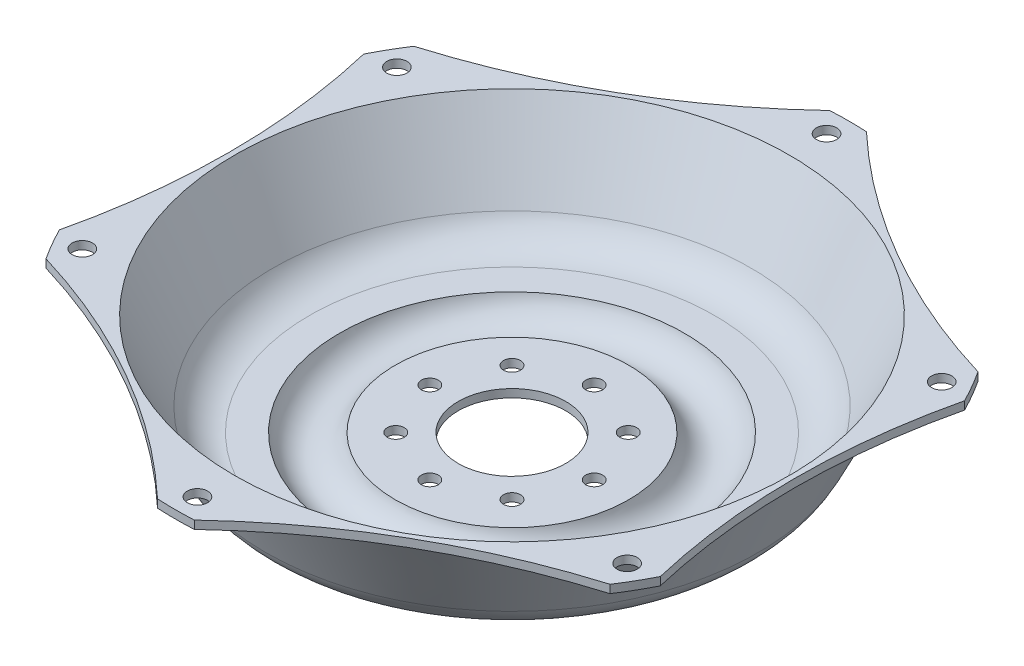
ISO-10303-21;
HEADER;
FILE_DESCRIPTION(('STEP AP214'),'2;1');
FILE_NAME('part.step','',(''),(''),'','','');
FILE_SCHEMA(('AUTOMOTIVE_DESIGN { 1 0 10303 214 1 1 1 1 }'));
ENDSEC;
DATA;
#1=APPLICATION_CONTEXT('core data for automotive mechanical design processes');
#2=APPLICATION_PROTOCOL_DEFINITION('international standard','automotive_design',2000,#1);
#3=PRODUCT_CONTEXT('',#1,'mechanical');
#4=PRODUCT('Part','Part','',(#3));
#5=PRODUCT_RELATED_PRODUCT_CATEGORY('part','',(#4));
#6=PRODUCT_DEFINITION_FORMATION('','',#4);
#7=PRODUCT_DEFINITION_CONTEXT('part definition',#1,'design');
#8=PRODUCT_DEFINITION('design','',#6,#7);
#9=PRODUCT_DEFINITION_SHAPE('','',#8);
#10=(LENGTH_UNIT() NAMED_UNIT(*) SI_UNIT(.MILLI.,.METRE.));
#11=(NAMED_UNIT(*) PLANE_ANGLE_UNIT() SI_UNIT($,.RADIAN.));
#12=(NAMED_UNIT(*) SI_UNIT($,.STERADIAN.) SOLID_ANGLE_UNIT());
#13=UNCERTAINTY_MEASURE_WITH_UNIT(LENGTH_MEASURE(1.E-05),#10,'distance_accuracy_value','');
#14=(GEOMETRIC_REPRESENTATION_CONTEXT(3) GLOBAL_UNCERTAINTY_ASSIGNED_CONTEXT((#13)) GLOBAL_UNIT_ASSIGNED_CONTEXT((#10,
#11,#12)) REPRESENTATION_CONTEXT('',''));
#15=CARTESIAN_POINT('',(0.,0.,0.));
#16=DIRECTION('',(0.,0.,1.));
#17=DIRECTION('',(1.,0.,0.));
#18=AXIS2_PLACEMENT_3D('',#15,#16,#17);
#19=CARTESIAN_POINT('',(0.,150.,0.));
#20=DIRECTION('',(0.,1.,0.));
#21=DIRECTION('',(0.,0.,1.));
#22=AXIS2_PLACEMENT_3D('',#19,#20,#21);
#23=CYLINDRICAL_SURFACE('',#22,497.75);
#24=CARTESIAN_POINT('',(0.,150.,0.));
#25=DIRECTION('',(0.,1.,0.));
#26=DIRECTION('',(0.,0.,1.));
#27=AXIS2_PLACEMENT_3D('',#24,#25,#26);
#28=CIRCLE('',#27,497.75);
#29=CARTESIAN_POINT('',(443.929491177126,150.,-225.12589669609));
#30=VERTEX_POINT('',#29);
#31=CARTESIAN_POINT('',(416.775220580377,150.,-272.127686959961));
#32=VERTEX_POINT('',#31);
#33=EDGE_CURVE('E160',#30,#32,#28,.T.);
#34=ORIENTED_EDGE('',*,*,#33,.F.);
#35=DIRECTION('',(0.,-1.,0.));
#36=VECTOR('',#35,1.);
#37=CARTESIAN_POINT('',(443.929491177126,150.,-225.12589669609));
#38=LINE('',#37,#36);
#39=CARTESIAN_POINT('',(443.929491177126,138.,-225.12589669609));
#40=VERTEX_POINT('',#39);
#41=EDGE_CURVE('E145',#30,#40,#38,.T.);
#42=ORIENTED_EDGE('',*,*,#41,.T.);
#43=CARTESIAN_POINT('',(0.,138.,0.));
#44=DIRECTION('',(0.,1.,0.));
#45=DIRECTION('',(0.,0.,1.));
#46=AXIS2_PLACEMENT_3D('',#43,#44,#45);
#47=CIRCLE('',#46,497.75);
#48=CARTESIAN_POINT('',(416.775220580377,138.,-272.127686959961));
#49=VERTEX_POINT('',#48);
#50=EDGE_CURVE('E158',#40,#49,#47,.T.);
#51=ORIENTED_EDGE('',*,*,#50,.T.);
#52=DIRECTION('',(0.,-1.,0.));
#53=VECTOR('',#52,1.);
#54=CARTESIAN_POINT('',(416.775220580377,150.,-272.127686959961));
#55=LINE('',#54,#53);
#56=EDGE_CURVE('E295',#32,#49,#55,.T.);
#57=ORIENTED_EDGE('',*,*,#56,.F.);
#58=EDGE_LOOP('',(#34,#42,#51,#57));
#59=FACE_BOUND('',#58,.T.);
#60=ADVANCED_FACE('F37',(#59),#23,.T.);
#61=CARTESIAN_POINT('',(416.929491177127,138.,271.891268500447));
#62=VERTEX_POINT('',#61);
#63=CARTESIAN_POINT('',(444.057100270615,138.,224.874085210487));
#64=VERTEX_POINT('',#63);
#65=EDGE_CURVE('E167',#62,#64,#47,.T.);
#66=ORIENTED_EDGE('',*,*,#65,.T.);
#67=DIRECTION('',(0.,-1.,0.));
#68=VECTOR('',#67,1.);
#69=CARTESIAN_POINT('',(444.057100270615,150.,224.874085210487));
#70=LINE('',#69,#68);
#71=CARTESIAN_POINT('',(444.057100270615,150.,224.874085210487));
#72=VERTEX_POINT('',#71);
#73=EDGE_CURVE('E305',#72,#64,#70,.T.);
#74=ORIENTED_EDGE('',*,*,#73,.F.);
#75=CARTESIAN_POINT('',(416.929491177127,150.,271.891268500447));
#76=VERTEX_POINT('',#75);
#77=EDGE_CURVE('E217',#76,#72,#28,.T.);
#78=ORIENTED_EDGE('',*,*,#77,.F.);
#79=DIRECTION('',(0.,-1.,0.));
#80=VECTOR('',#79,1.);
#81=CARTESIAN_POINT('',(416.929491177127,150.,271.891268500447));
#82=LINE('',#81,#80);
#83=EDGE_CURVE('E270',#76,#62,#82,.T.);
#84=ORIENTED_EDGE('',*,*,#83,.T.);
#85=EDGE_LOOP('',(#66,#74,#78,#84));
#86=FACE_BOUND('',#85,.T.);
#87=ADVANCED_FACE('F408',(#86),#23,.T.);
#88=CARTESIAN_POINT('',(27.,150.,-497.017165196535));
#89=VERTEX_POINT('',#88);
#90=CARTESIAN_POINT('',(-27.2818796902415,150.,-497.001772170449));
#91=VERTEX_POINT('',#90);
#92=EDGE_CURVE('E447',#89,#91,#28,.T.);
#93=ORIENTED_EDGE('',*,*,#92,.F.);
#94=DIRECTION('',(0.,-1.,0.));
#95=VECTOR('',#94,1.);
#96=CARTESIAN_POINT('',(27.,150.,-497.017165196535));
#97=LINE('',#96,#95);
#98=CARTESIAN_POINT('',(27.,138.,-497.017165196535));
#99=VERTEX_POINT('',#98);
#100=EDGE_CURVE('E299',#89,#99,#97,.T.);
#101=ORIENTED_EDGE('',*,*,#100,.T.);
#102=CARTESIAN_POINT('',(-27.2818796902415,138.,-497.001772170449));
#103=VERTEX_POINT('',#102);
#104=EDGE_CURVE('E168',#99,#103,#47,.T.);
#105=ORIENTED_EDGE('',*,*,#104,.T.);
#106=DIRECTION('',(0.,-1.,0.));
#107=VECTOR('',#106,1.);
#108=CARTESIAN_POINT('',(-27.2818796902415,150.,-497.001772170449));
#109=LINE('',#108,#107);
#110=EDGE_CURVE('E286',#91,#103,#109,.T.);
#111=ORIENTED_EDGE('',*,*,#110,.F.);
#112=EDGE_LOOP('',(#93,#101,#105,#111));
#113=FACE_BOUND('',#112,.T.);
#114=ADVANCED_FACE('F413',(#113),#23,.T.);
#115=CARTESIAN_POINT('',(-416.929491177129,150.,-271.891268500444));
#116=VERTEX_POINT('',#115);
#117=CARTESIAN_POINT('',(-444.057100270616,150.,-224.874085210484));
#118=VERTEX_POINT('',#117);
#119=EDGE_CURVE('E445',#116,#118,#28,.T.);
#120=ORIENTED_EDGE('',*,*,#119,.F.);
#121=DIRECTION('',(0.,-1.,0.));
#122=VECTOR('',#121,1.);
#123=CARTESIAN_POINT('',(-416.929491177129,150.,-271.891268500444));
#124=LINE('',#123,#122);
#125=CARTESIAN_POINT('',(-416.929491177129,138.,-271.891268500444));
#126=VERTEX_POINT('',#125);
#127=EDGE_CURVE('E290',#116,#126,#124,.T.);
#128=ORIENTED_EDGE('',*,*,#127,.T.);
#129=CARTESIAN_POINT('',(-444.057100270616,138.,-224.874085210484));
#130=VERTEX_POINT('',#129);
#131=EDGE_CURVE('E172',#126,#130,#47,.T.);
#132=ORIENTED_EDGE('',*,*,#131,.T.);
#133=DIRECTION('',(0.,-1.,0.));
#134=VECTOR('',#133,1.);
#135=CARTESIAN_POINT('',(-444.057100270616,150.,-224.874085210484));
#136=LINE('',#135,#134);
#137=EDGE_CURVE('E277',#118,#130,#136,.T.);
#138=ORIENTED_EDGE('',*,*,#137,.F.);
#139=EDGE_LOOP('',(#120,#128,#132,#138));
#140=FACE_BOUND('',#139,.T.);
#141=ADVANCED_FACE('F431',(#140),#23,.T.);
#142=CARTESIAN_POINT('',(-443.929491177124,150.,225.125896696093));
#143=VERTEX_POINT('',#142);
#144=CARTESIAN_POINT('',(-416.775220580377,150.,272.127686959961));
#145=VERTEX_POINT('',#144);
#146=EDGE_CURVE('E214',#143,#145,#28,.T.);
#147=ORIENTED_EDGE('',*,*,#146,.F.);
#148=DIRECTION('',(0.,-1.,0.));
#149=VECTOR('',#148,1.);
#150=CARTESIAN_POINT('',(-443.929491177124,150.,225.125896696093));
#151=LINE('',#150,#149);
#152=CARTESIAN_POINT('',(-443.929491177124,138.,225.125896696093));
#153=VERTEX_POINT('',#152);
#154=EDGE_CURVE('E281',#143,#153,#151,.T.);
#155=ORIENTED_EDGE('',*,*,#154,.T.);
#156=CARTESIAN_POINT('',(-416.775220580377,138.,272.127686959961));
#157=VERTEX_POINT('',#156);
#158=EDGE_CURVE('E176',#153,#157,#47,.T.);
#159=ORIENTED_EDGE('',*,*,#158,.T.);
#160=DIRECTION('',(0.,-1.,0.));
#161=VECTOR('',#160,1.);
#162=CARTESIAN_POINT('',(-416.775220580377,150.,272.127686959961));
#163=LINE('',#162,#161);
#164=EDGE_CURVE('E221',#145,#157,#163,.T.);
#165=ORIENTED_EDGE('',*,*,#164,.F.);
#166=EDGE_LOOP('',(#147,#155,#159,#165));
#167=FACE_BOUND('',#166,.T.);
#168=ADVANCED_FACE('F419',(#167),#23,.T.);
#169=CARTESIAN_POINT('',(410.214525598978,138.,0.));
#170=DIRECTION('',(0.,1.,0.));
#171=DIRECTION('',(0.,0.,1.));
#172=AXIS2_PLACEMENT_3D('',#169,#170,#171);
#173=PLANE('',#172);
#174=CARTESIAN_POINT('',(1394.02497264132,138.,-0.39531171158369));
#175=DIRECTION('',(0.,-1.,0.));
#176=DIRECTION('',(-0.866025403784436,0.,0.500000000000004));
#177=AXIS2_PLACEMENT_3D('',#174,#175,#176);
#178=CIRCLE('',#177,976.312070869839);
#179=CARTESIAN_POINT('',(417.712941026651,138.,-0.118453270858577));
#180=VERTEX_POINT('',#179);
#181=EDGE_CURVE('E148',#180,#64,#178,.F.);
#182=ORIENTED_EDGE('',*,*,#181,.T.);
#183=ORIENTED_EDGE('',*,*,#65,.F.);
#184=CARTESIAN_POINT('',(697.354836305301,138.,1207.0633839615));
#185=DIRECTION('',(0.,-1.,0.));
#186=DIRECTION('',(-0.86602540378444,0.,-0.499999999999998));
#187=AXIS2_PLACEMENT_3D('',#184,#185,#186);
#188=CIRCLE('',#187,976.312070869839);
#189=CARTESIAN_POINT('',(208.95905405505,138.,361.690791783162));
#190=VERTEX_POINT('',#189);
#191=EDGE_CURVE('E273',#62,#190,#188,.F.);
#192=ORIENTED_EDGE('',*,*,#191,.T.);
#193=CARTESIAN_POINT('',(0.,138.,0.));
#194=DIRECTION('',(0.,1.,0.));
#195=DIRECTION('',(0.,0.,1.));
#196=AXIS2_PLACEMENT_3D('',#193,#194,#195);
#197=CIRCLE('',#196,417.71295782189);
#198=EDGE_CURVE('E185',#190,#180,#197,.T.);
#199=ORIENTED_EDGE('',*,*,#198,.T.);
#200=EDGE_LOOP('',(#182,#183,#192,#199));
#201=FACE_BOUND('',#200,.T.);
#202=CARTESIAN_POINT('',(402.701812759764,138.,232.499999999999));
#203=DIRECTION('',(0.,-1.,0.));
#204=DIRECTION('',(-0.86602540378444,0.,-0.499999999999998));
#205=AXIS2_PLACEMENT_3D('',#202,#203,#204);
#206=CIRCLE('',#205,15.);
#207=CARTESIAN_POINT('',(389.711431702998,138.,224.999999999999));
#208=VERTEX_POINT('',#207);
#209=EDGE_CURVE('E234',#208,#208,#206,.T.);
#210=ORIENTED_EDGE('',*,*,#209,.F.);
#211=EDGE_LOOP('',(#210));
#212=FACE_BOUND('',#211,.T.);
#213=ADVANCED_FACE('F430',(#201,#212),#173,.F.);
#214=EDGE_CURVE('E142',#40,#180,#178,.F.);
#215=ORIENTED_EDGE('',*,*,#214,.T.);
#216=CARTESIAN_POINT('',(208.753886971602,138.,-361.809245054019));
#217=VERTEX_POINT('',#216);
#218=EDGE_CURVE('E463',#180,#217,#197,.T.);
#219=ORIENTED_EDGE('',*,*,#218,.T.);
#220=CARTESIAN_POINT('',(696.67013633602,138.,-1207.45869567308));
#221=DIRECTION('',(0.,-1.,0.));
#222=DIRECTION('',(0.,0.,1.));
#223=AXIS2_PLACEMENT_3D('',#220,#221,#222);
#224=CIRCLE('',#223,976.312070869839);
#225=EDGE_CURVE('E166',#217,#49,#224,.F.);
#226=ORIENTED_EDGE('',*,*,#225,.T.);
#227=ORIENTED_EDGE('',*,*,#50,.F.);
#228=EDGE_LOOP('',(#215,#219,#226,#227));
#229=FACE_BOUND('',#228,.T.);
#230=CARTESIAN_POINT('',(402.701812759763,138.,-232.500000000002));
#231=DIRECTION('',(0.,-1.,0.));
#232=DIRECTION('',(-0.866025403784436,0.,0.500000000000004));
#233=AXIS2_PLACEMENT_3D('',#230,#231,#232);
#234=CIRCLE('',#233,15.);
#235=CARTESIAN_POINT('',(389.711431702996,138.,-225.000000000002));
#236=VERTEX_POINT('',#235);
#237=EDGE_CURVE('E242',#236,#236,#234,.T.);
#238=ORIENTED_EDGE('',*,*,#237,.F.);
#239=EDGE_LOOP('',(#238));
#240=FACE_BOUND('',#239,.T.);
#241=ADVANCED_FACE('F164',(#229,#240),#173,.F.);
#242=EDGE_CURVE('E302',#99,#217,#224,.F.);
#243=ORIENTED_EDGE('',*,*,#242,.T.);
#244=CARTESIAN_POINT('',(-208.959054055052,138.,-361.690791783161));
#245=VERTEX_POINT('',#244);
#246=EDGE_CURVE('E464',#217,#245,#197,.T.);
#247=ORIENTED_EDGE('',*,*,#246,.T.);
#248=CARTESIAN_POINT('',(-697.35483630531,138.,-1207.06338396149));
#249=DIRECTION('',(0.,-1.,0.));
#250=DIRECTION('',(0.866025403784443,0.,0.499999999999992));
#251=AXIS2_PLACEMENT_3D('',#248,#249,#250);
#252=CIRCLE('',#251,976.312070869839);
#253=EDGE_CURVE('E59',#245,#103,#252,.F.);
#254=ORIENTED_EDGE('',*,*,#253,.T.);
#255=ORIENTED_EDGE('',*,*,#104,.F.);
#256=EDGE_LOOP('',(#243,#247,#254,#255));
#257=FACE_BOUND('',#256,.T.);
#258=CARTESIAN_POINT('',(0.,138.,-465.));
#259=DIRECTION('',(0.,-1.,0.));
#260=DIRECTION('',(0.,0.,1.));
#261=AXIS2_PLACEMENT_3D('',#258,#259,#260);
#262=CIRCLE('',#261,15.);
#263=CARTESIAN_POINT('',(0.,138.,-450.));
#264=VERTEX_POINT('',#263);
#265=EDGE_CURVE('E257',#264,#264,#262,.T.);
#266=ORIENTED_EDGE('',*,*,#265,.F.);
#267=EDGE_LOOP('',(#266));
#268=FACE_BOUND('',#267,.T.);
#269=ADVANCED_FACE('F427',(#257,#268),#173,.F.);
#270=EDGE_CURVE('E293',#126,#245,#252,.F.);
#271=ORIENTED_EDGE('',*,*,#270,.T.);
#272=CARTESIAN_POINT('',(-417.712941026651,138.,0.118453270861505));
#273=VERTEX_POINT('',#272);
#274=EDGE_CURVE('E466',#245,#273,#197,.T.);
#275=ORIENTED_EDGE('',*,*,#274,.T.);
#276=CARTESIAN_POINT('',(-1394.02497264132,138.,0.39531171159346));
#277=DIRECTION('',(0.,-1.,0.));
#278=DIRECTION('',(0.866025403784433,0.,-0.50000000000001));
#279=AXIS2_PLACEMENT_3D('',#276,#277,#278);
#280=CIRCLE('',#279,976.312070869839);
#281=EDGE_CURVE('E51',#273,#130,#280,.F.);
#282=ORIENTED_EDGE('',*,*,#281,.T.);
#283=ORIENTED_EDGE('',*,*,#131,.F.);
#284=EDGE_LOOP('',(#271,#275,#282,#283));
#285=FACE_BOUND('',#284,.T.);
#286=CARTESIAN_POINT('',(-402.701812759766,138.,-232.499999999996));
#287=DIRECTION('',(0.,-1.,0.));
#288=DIRECTION('',(0.866025403784443,0.,0.499999999999992));
#289=AXIS2_PLACEMENT_3D('',#286,#287,#288);
#290=CIRCLE('',#289,15.);
#291=CARTESIAN_POINT('',(-389.711431703,138.,-224.999999999996));
#292=VERTEX_POINT('',#291);
#293=EDGE_CURVE('E251',#292,#292,#290,.T.);
#294=ORIENTED_EDGE('',*,*,#293,.F.);
#295=EDGE_LOOP('',(#294));
#296=FACE_BOUND('',#295,.T.);
#297=ADVANCED_FACE('F417',(#285,#296),#173,.F.);
#298=CARTESIAN_POINT('',(-27.,138.,497.017165196535));
#299=VERTEX_POINT('',#298);
#300=CARTESIAN_POINT('',(27.2818796902381,138.,497.001772170449));
#301=VERTEX_POINT('',#300);
#302=EDGE_CURVE('E170',#299,#301,#47,.T.);
#303=ORIENTED_EDGE('',*,*,#302,.T.);
#304=DIRECTION('',(0.,-1.,0.));
#305=VECTOR('',#304,1.);
#306=CARTESIAN_POINT('',(27.2818796902381,150.,497.001772170449));
#307=LINE('',#306,#305);
#308=CARTESIAN_POINT('',(27.2818796902381,150.,497.001772170449));
#309=VERTEX_POINT('',#308);
#310=EDGE_CURVE('E250',#309,#301,#307,.T.);
#311=ORIENTED_EDGE('',*,*,#310,.F.);
#312=CARTESIAN_POINT('',(-27.,150.,497.017165196535));
#313=VERTEX_POINT('',#312);
#314=EDGE_CURVE('E211',#313,#309,#28,.T.);
#315=ORIENTED_EDGE('',*,*,#314,.F.);
#316=DIRECTION('',(0.,-1.,0.));
#317=VECTOR('',#316,1.);
#318=CARTESIAN_POINT('',(-27.,150.,497.017165196535));
#319=LINE('',#318,#317);
#320=EDGE_CURVE('E218',#313,#299,#319,.T.);
#321=ORIENTED_EDGE('',*,*,#320,.T.);
#322=EDGE_LOOP('',(#303,#311,#315,#321));
#323=FACE_BOUND('',#322,.T.);
#324=ADVANCED_FACE('F409',(#323),#23,.T.);
#325=EDGE_CURVE('E276',#190,#301,#188,.F.);
#326=ORIENTED_EDGE('',*,*,#325,.T.);
#327=ORIENTED_EDGE('',*,*,#302,.F.);
#328=CARTESIAN_POINT('',(-696.67013633602,138.,1207.45869567308));
#329=DIRECTION('',(0.,-1.,0.));
#330=DIRECTION('',(0.,0.,-1.));
#331=AXIS2_PLACEMENT_3D('',#328,#329,#330);
#332=CIRCLE('',#331,976.312070869839);
#333=CARTESIAN_POINT('',(-208.753886971602,138.,361.809245054019));
#334=VERTEX_POINT('',#333);
#335=EDGE_CURVE('E225',#299,#334,#332,.F.);
#336=ORIENTED_EDGE('',*,*,#335,.T.);
#337=EDGE_CURVE('E182',#334,#190,#197,.T.);
#338=ORIENTED_EDGE('',*,*,#337,.T.);
#339=EDGE_LOOP('',(#326,#327,#336,#338));
#340=FACE_BOUND('',#339,.T.);
#341=CARTESIAN_POINT('',(0.,138.,465.));
#342=DIRECTION('',(0.,-1.,0.));
#343=DIRECTION('',(0.,0.,-1.));
#344=AXIS2_PLACEMENT_3D('',#341,#342,#343);
#345=CIRCLE('',#344,15.);
#346=CARTESIAN_POINT('',(0.,138.,450.));
#347=VERTEX_POINT('',#346);
#348=EDGE_CURVE('E231',#347,#347,#345,.T.);
#349=ORIENTED_EDGE('',*,*,#348,.F.);
#350=EDGE_LOOP('',(#349));
#351=FACE_BOUND('',#350,.T.);
#352=ADVANCED_FACE('F416',(#340,#351),#173,.F.);
#353=CARTESIAN_POINT('',(410.214525598978,150.,0.));
#354=DIRECTION('',(0.,1.,0.));
#355=DIRECTION('',(0.,0.,1.));
#356=AXIS2_PLACEMENT_3D('',#353,#354,#355);
#357=PLANE('',#356);
#358=CARTESIAN_POINT('',(402.701812759763,150.,-232.500000000002));
#359=DIRECTION('',(0.,-1.,0.));
#360=DIRECTION('',(-0.866025403784436,0.,0.500000000000004));
#361=AXIS2_PLACEMENT_3D('',#358,#359,#360);
#362=CIRCLE('',#361,15.);
#363=CARTESIAN_POINT('',(389.711431702996,150.,-225.000000000002));
#364=VERTEX_POINT('',#363);
#365=EDGE_CURVE('E260',#364,#364,#362,.T.);
#366=ORIENTED_EDGE('',*,*,#365,.T.);
#367=EDGE_LOOP('',(#366));
#368=FACE_BOUND('',#367,.T.);
#369=CARTESIAN_POINT('',(0.,150.,-465.));
#370=DIRECTION('',(0.,-1.,0.));
#371=DIRECTION('',(0.,0.,1.));
#372=AXIS2_PLACEMENT_3D('',#369,#370,#371);
#373=CIRCLE('',#372,15.);
#374=CARTESIAN_POINT('',(0.,150.,-450.));
#375=VERTEX_POINT('',#374);
#376=EDGE_CURVE('E254',#375,#375,#373,.T.);
#377=ORIENTED_EDGE('',*,*,#376,.T.);
#378=EDGE_LOOP('',(#377));
#379=FACE_BOUND('',#378,.T.);
#380=CARTESIAN_POINT('',(-402.701812759766,150.,-232.499999999996));
#381=DIRECTION('',(0.,-1.,0.));
#382=DIRECTION('',(0.866025403784443,0.,0.499999999999992));
#383=AXIS2_PLACEMENT_3D('',#380,#381,#382);
#384=CIRCLE('',#383,15.);
#385=CARTESIAN_POINT('',(-389.711431703,150.,-224.999999999996));
#386=VERTEX_POINT('',#385);
#387=EDGE_CURVE('E246',#386,#386,#384,.T.);
#388=ORIENTED_EDGE('',*,*,#387,.T.);
#389=EDGE_LOOP('',(#388));
#390=FACE_BOUND('',#389,.T.);
#391=CARTESIAN_POINT('',(-402.701812759761,150.,232.500000000005));
#392=DIRECTION('',(0.,-1.,0.));
#393=DIRECTION('',(0.866025403784433,0.,-0.50000000000001));
#394=AXIS2_PLACEMENT_3D('',#391,#392,#393);
#395=CIRCLE('',#394,15.);
#396=CARTESIAN_POINT('',(-389.711431702995,150.,225.000000000005));
#397=VERTEX_POINT('',#396);
#398=EDGE_CURVE('E247',#397,#397,#395,.T.);
#399=ORIENTED_EDGE('',*,*,#398,.T.);
#400=EDGE_LOOP('',(#399));
#401=FACE_BOUND('',#400,.T.);
#402=CARTESIAN_POINT('',(402.701812759764,150.,232.499999999999));
#403=DIRECTION('',(0.,-1.,0.));
#404=DIRECTION('',(-0.86602540378444,0.,-0.499999999999998));
#405=AXIS2_PLACEMENT_3D('',#402,#403,#404);
#406=CIRCLE('',#405,15.);
#407=CARTESIAN_POINT('',(389.711431702998,150.,224.999999999999));
#408=VERTEX_POINT('',#407);
#409=EDGE_CURVE('E239',#408,#408,#406,.T.);
#410=ORIENTED_EDGE('',*,*,#409,.T.);
#411=EDGE_LOOP('',(#410));
#412=FACE_BOUND('',#411,.T.);
#413=CARTESIAN_POINT('',(0.,150.,465.));
#414=DIRECTION('',(0.,-1.,0.));
#415=DIRECTION('',(0.,0.,-1.));
#416=AXIS2_PLACEMENT_3D('',#413,#414,#415);
#417=CIRCLE('',#416,15.);
#418=CARTESIAN_POINT('',(0.,150.,450.));
#419=VERTEX_POINT('',#418);
#420=EDGE_CURVE('E228',#419,#419,#417,.T.);
#421=ORIENTED_EDGE('',*,*,#420,.T.);
#422=EDGE_LOOP('',(#421));
#423=FACE_BOUND('',#422,.T.);
#424=CARTESIAN_POINT('',(0.,150.,0.));
#425=DIRECTION('',(0.,1.,0.));
#426=DIRECTION('',(0.,0.,1.));
#427=AXIS2_PLACEMENT_3D('',#424,#425,#426);
#428=CIRCLE('',#427,410.214525598978);
#429=CARTESIAN_POINT('',(0.,150.,410.214525598978));
#430=VERTEX_POINT('',#429);
#431=EDGE_CURVE('E180',#430,#430,#428,.T.);
#432=ORIENTED_EDGE('',*,*,#431,.F.);
#433=EDGE_LOOP('',(#432));
#434=FACE_BOUND('',#433,.T.);
#435=ORIENTED_EDGE('',*,*,#77,.T.);
#436=CARTESIAN_POINT('',(1394.02497264132,150.,-0.39531171158369));
#437=DIRECTION('',(0.,-1.,0.));
#438=DIRECTION('',(-0.866025403784436,0.,0.500000000000004));
#439=AXIS2_PLACEMENT_3D('',#436,#437,#438);
#440=CIRCLE('',#439,976.312070869839);
#441=EDGE_CURVE('E161',#30,#72,#440,.F.);
#442=ORIENTED_EDGE('',*,*,#441,.F.);
#443=ORIENTED_EDGE('',*,*,#33,.T.);
#444=CARTESIAN_POINT('',(696.67013633602,150.,-1207.45869567308));
#445=DIRECTION('',(0.,-1.,0.));
#446=DIRECTION('',(0.,0.,1.));
#447=AXIS2_PLACEMENT_3D('',#444,#445,#446);
#448=CIRCLE('',#447,976.312070869839);
#449=EDGE_CURVE('E297',#89,#32,#448,.F.);
#450=ORIENTED_EDGE('',*,*,#449,.F.);
#451=ORIENTED_EDGE('',*,*,#92,.T.);
#452=CARTESIAN_POINT('',(-697.35483630531,150.,-1207.06338396149));
#453=DIRECTION('',(0.,-1.,0.));
#454=DIRECTION('',(0.866025403784443,0.,0.499999999999992));
#455=AXIS2_PLACEMENT_3D('',#452,#453,#454);
#456=CIRCLE('',#455,976.312070869839);
#457=EDGE_CURVE('E288',#116,#91,#456,.F.);
#458=ORIENTED_EDGE('',*,*,#457,.F.);
#459=ORIENTED_EDGE('',*,*,#119,.T.);
#460=CARTESIAN_POINT('',(-1394.02497264132,150.,0.39531171159346));
#461=DIRECTION('',(0.,-1.,0.));
#462=DIRECTION('',(0.866025403784433,0.,-0.50000000000001));
#463=AXIS2_PLACEMENT_3D('',#460,#461,#462);
#464=CIRCLE('',#463,976.312070869839);
#465=EDGE_CURVE('E279',#143,#118,#464,.F.);
#466=ORIENTED_EDGE('',*,*,#465,.F.);
#467=ORIENTED_EDGE('',*,*,#146,.T.);
#468=CARTESIAN_POINT('',(-696.67013633602,150.,1207.45869567308));
#469=DIRECTION('',(0.,-1.,0.));
#470=DIRECTION('',(0.,0.,-1.));
#471=AXIS2_PLACEMENT_3D('',#468,#469,#470);
#472=CIRCLE('',#471,976.312070869839);
#473=EDGE_CURVE('E222',#313,#145,#472,.F.);
#474=ORIENTED_EDGE('',*,*,#473,.F.);
#475=ORIENTED_EDGE('',*,*,#314,.T.);
#476=CARTESIAN_POINT('',(697.354836305301,150.,1207.0633839615));
#477=DIRECTION('',(0.,-1.,0.));
#478=DIRECTION('',(-0.86602540378444,0.,-0.499999999999998));
#479=AXIS2_PLACEMENT_3D('',#476,#477,#478);
#480=CIRCLE('',#479,976.312070869839);
#481=EDGE_CURVE('E268',#76,#309,#480,.F.);
#482=ORIENTED_EDGE('',*,*,#481,.F.);
#483=EDGE_LOOP('',(#435,#442,#443,#450,#451,#458,#459,#466,#467,#474,#475,#482));
#484=FACE_BOUND('',#483,.T.);
#485=ADVANCED_FACE('F424',(#368,#379,#390,#401,#412,#423,#434,#484),#357,.T.);
#486=EDGE_CURVE('E284',#153,#273,#280,.F.);
#487=ORIENTED_EDGE('',*,*,#486,.T.);
#488=EDGE_CURVE('E186',#273,#334,#197,.T.);
#489=ORIENTED_EDGE('',*,*,#488,.T.);
#490=CARTESIAN_POINT('',(-696.67013633602,138.,1207.45869567308));
#491=DIRECTION('',(0.,1.,0.));
#492=DIRECTION('',(0.,0.,1.));
#493=AXIS2_PLACEMENT_3D('',#490,#491,#492);
#494=CIRCLE('',#493,976.312070869839);
#495=EDGE_CURVE('E12',#157,#334,#494,.F.);
#496=ORIENTED_EDGE('',*,*,#495,.F.);
#497=ORIENTED_EDGE('',*,*,#158,.F.);
#498=EDGE_LOOP('',(#487,#489,#496,#497));
#499=FACE_BOUND('',#498,.T.);
#500=CARTESIAN_POINT('',(-402.701812759761,138.,232.500000000005));
#501=DIRECTION('',(0.,-1.,0.));
#502=DIRECTION('',(0.866025403784433,0.,-0.50000000000001));
#503=AXIS2_PLACEMENT_3D('',#500,#501,#502);
#504=CIRCLE('',#503,15.);
#505=CARTESIAN_POINT('',(-389.711431702995,138.,225.000000000005));
#506=VERTEX_POINT('',#505);
#507=EDGE_CURVE('E243',#506,#506,#504,.T.);
#508=ORIENTED_EDGE('',*,*,#507,.F.);
#509=EDGE_LOOP('',(#508));
#510=FACE_BOUND('',#509,.T.);
#511=ADVANCED_FACE('F386',(#499,#510),#173,.F.);
#512=CARTESIAN_POINT('',(0.,0.,0.));
#513=DIRECTION('',(0.,1.,0.));
#514=DIRECTION('',(0.,0.,1.));
#515=AXIS2_PLACEMENT_3D('',#512,#513,#514);
#516=CYLINDRICAL_SURFACE('',#515,79.5);
#517=CARTESIAN_POINT('',(0.,0.,0.));
#518=DIRECTION('',(0.,1.,0.));
#519=DIRECTION('',(0.,0.,1.));
#520=AXIS2_PLACEMENT_3D('',#517,#518,#519);
#521=CIRCLE('',#520,79.5);
#522=CARTESIAN_POINT('',(0.,0.,79.5));
#523=VERTEX_POINT('',#522);
#524=EDGE_CURVE('E44',#523,#523,#521,.T.);
#525=ORIENTED_EDGE('',*,*,#524,.T.);
#526=EDGE_LOOP('',(#525));
#527=FACE_BOUND('',#526,.T.);
#528=CARTESIAN_POINT('',(0.,-12.,0.));
#529=DIRECTION('',(0.,1.,0.));
#530=DIRECTION('',(0.,0.,1.));
#531=AXIS2_PLACEMENT_3D('',#528,#529,#530);
#532=CIRCLE('',#531,79.5);
#533=CARTESIAN_POINT('',(0.,-12.,79.5));
#534=VERTEX_POINT('',#533);
#535=EDGE_CURVE('E177',#534,#534,#532,.T.);
#536=ORIENTED_EDGE('',*,*,#535,.F.);
#537=EDGE_LOOP('',(#536));
#538=FACE_BOUND('',#537,.T.);
#539=ADVANCED_FACE('F364',(#527,#538),#516,.F.);
#540=CARTESIAN_POINT('',(79.5,0.,0.));
#541=DIRECTION('',(0.,1.,0.));
#542=DIRECTION('',(0.,0.,1.));
#543=AXIS2_PLACEMENT_3D('',#540,#541,#542);
#544=PLANE('',#543);
#545=CARTESIAN_POINT('',(121.5,0.,-4.24214982669441E-13));
#546=DIRECTION('',(0.,1.,0.));
#547=DIRECTION('',(1.,0.,0.));
#548=AXIS2_PLACEMENT_3D('',#545,#546,#547);
#549=CIRCLE('',#548,12.5);
#550=CARTESIAN_POINT('',(134.,0.,-4.6785849940498E-13));
#551=VERTEX_POINT('',#550);
#552=EDGE_CURVE('E349',#551,#551,#549,.T.);
#553=ORIENTED_EDGE('',*,*,#552,.F.);
#554=EDGE_LOOP('',(#553));
#555=FACE_BOUND('',#554,.T.);
#556=CARTESIAN_POINT('',(85.9134739141651,0.,-85.913473914166));
#557=DIRECTION('',(0.,1.,0.));
#558=DIRECTION('',(0.707106781186544,0.,-0.707106781186551));
#559=AXIS2_PLACEMENT_3D('',#556,#557,#558);
#560=CIRCLE('',#559,12.5);
#561=CARTESIAN_POINT('',(94.7523086789969,0.,-94.7523086789978));
#562=VERTEX_POINT('',#561);
#563=EDGE_CURVE('E343',#562,#562,#560,.T.);
#564=ORIENTED_EDGE('',*,*,#563,.F.);
#565=EDGE_LOOP('',(#564));
#566=FACE_BOUND('',#565,.T.);
#567=CARTESIAN_POINT('',(0.,0.,-121.5));
#568=DIRECTION('',(0.,1.,0.));
#569=DIRECTION('',(0.,0.,-1.));
#570=AXIS2_PLACEMENT_3D('',#567,#568,#569);
#571=CIRCLE('',#570,12.5);
#572=CARTESIAN_POINT('',(0.,0.,-134.));
#573=VERTEX_POINT('',#572);
#574=EDGE_CURVE('E337',#573,#573,#571,.T.);
#575=ORIENTED_EDGE('',*,*,#574,.F.);
#576=EDGE_LOOP('',(#575));
#577=FACE_BOUND('',#576,.T.);
#578=CARTESIAN_POINT('',(-85.9134739141663,0.,-85.9134739141648));
#579=DIRECTION('',(0.,1.,0.));
#580=DIRECTION('',(-0.707106781186554,0.,-0.707106781186541));
#581=AXIS2_PLACEMENT_3D('',#578,#579,#580);
#582=CIRCLE('',#581,12.5);
#583=CARTESIAN_POINT('',(-94.7523086789982,0.,-94.7523086789965));
#584=VERTEX_POINT('',#583);
#585=EDGE_CURVE('E331',#584,#584,#582,.T.);
#586=ORIENTED_EDGE('',*,*,#585,.F.);
#587=EDGE_LOOP('',(#586));
#588=FACE_BOUND('',#587,.T.);
#589=CARTESIAN_POINT('',(-121.5,0.,1.27264494800832E-12));
#590=DIRECTION('',(0.,1.,0.));
#591=DIRECTION('',(-1.,0.,0.));
#592=AXIS2_PLACEMENT_3D('',#589,#590,#591);
#593=CIRCLE('',#592,12.5);
#594=CARTESIAN_POINT('',(-134.,0.,1.40357549821494E-12));
#595=VERTEX_POINT('',#594);
#596=EDGE_CURVE('E324',#595,#595,#593,.T.);
#597=ORIENTED_EDGE('',*,*,#596,.F.);
#598=EDGE_LOOP('',(#597));
#599=FACE_BOUND('',#598,.T.);
#600=CARTESIAN_POINT('',(-85.9134739141645,0.,85.9134739141666));
#601=DIRECTION('',(0.,1.,0.));
#602=DIRECTION('',(-0.707106781186539,0.,0.707106781186556));
#603=AXIS2_PLACEMENT_3D('',#600,#601,#602);
#604=CIRCLE('',#603,12.5);
#605=CARTESIAN_POINT('',(-94.7523086789962,0.,94.7523086789985));
#606=VERTEX_POINT('',#605);
#607=EDGE_CURVE('E325',#606,#606,#604,.T.);
#608=ORIENTED_EDGE('',*,*,#607,.F.);
#609=EDGE_LOOP('',(#608));
#610=FACE_BOUND('',#609,.T.);
#611=CARTESIAN_POINT('',(85.9134739141657,0.,85.9134739141654));
#612=DIRECTION('',(0.,1.,0.));
#613=DIRECTION('',(0.707106781186549,0.,0.707106781186546));
#614=AXIS2_PLACEMENT_3D('',#611,#612,#613);
#615=CIRCLE('',#614,12.5);
#616=CARTESIAN_POINT('',(94.7523086789975,0.,94.7523086789972));
#617=VERTEX_POINT('',#616);
#618=EDGE_CURVE('E317',#617,#617,#615,.T.);
#619=ORIENTED_EDGE('',*,*,#618,.F.);
#620=EDGE_LOOP('',(#619));
#621=FACE_BOUND('',#620,.T.);
#622=CARTESIAN_POINT('',(0.,0.,121.5));
#623=DIRECTION('',(0.,1.,0.));
#624=DIRECTION('',(0.,0.,1.));
#625=AXIS2_PLACEMENT_3D('',#622,#623,#624);
#626=CIRCLE('',#625,12.5);
#627=CARTESIAN_POINT('',(0.,0.,134.));
#628=VERTEX_POINT('',#627);
#629=EDGE_CURVE('E308',#628,#628,#626,.T.);
#630=ORIENTED_EDGE('',*,*,#629,.F.);
#631=EDGE_LOOP('',(#630));
#632=FACE_BOUND('',#631,.T.);
#633=CARTESIAN_POINT('',(0.,0.,0.));
#634=DIRECTION('',(0.,1.,0.));
#635=DIRECTION('',(0.,0.,1.));
#636=AXIS2_PLACEMENT_3D('',#633,#634,#635);
#637=CIRCLE('',#636,172.5);
#638=CARTESIAN_POINT('',(0.,0.,172.5));
#639=VERTEX_POINT('',#638);
#640=EDGE_CURVE('E199',#639,#639,#637,.T.);
#641=ORIENTED_EDGE('',*,*,#640,.T.);
#642=EDGE_LOOP('',(#641));
#643=FACE_BOUND('',#642,.T.);
#644=ORIENTED_EDGE('',*,*,#524,.F.);
#645=EDGE_LOOP('',(#644));
#646=FACE_BOUND('',#645,.T.);
#647=ADVANCED_FACE('F360',(#555,#566,#577,#588,#599,#610,#621,#632,#643,#646),#544,.T.);
#648=CARTESIAN_POINT('',(0.,12.,0.));
#649=DIRECTION('',(0.,1.,0.));
#650=DIRECTION('',(0.,0.,1.));
#651=AXIS2_PLACEMENT_3D('',#648,#649,#650);
#652=TOROIDAL_SURFACE('',#651,213.53123809977,42.75);
#653=CARTESIAN_POINT('',(0.,0.,0.));
#654=DIRECTION('',(0.,1.,0.));
#655=DIRECTION('',(0.,0.,1.));
#656=AXIS2_PLACEMENT_3D('',#653,#654,#655);
#657=CIRCLE('',#656,254.56247619954);
#658=CARTESIAN_POINT('',(0.,0.,254.56247619954));
#659=VERTEX_POINT('',#658);
#660=EDGE_CURVE('E202',#659,#659,#657,.T.);
#661=ORIENTED_EDGE('',*,*,#660,.T.);
#662=EDGE_LOOP('',(#661));
#663=FACE_BOUND('',#662,.T.);
#664=ORIENTED_EDGE('',*,*,#640,.F.);
#665=EDGE_LOOP('',(#664));
#666=FACE_BOUND('',#665,.T.);
#667=ADVANCED_FACE('F363',(#663,#666),#652,.F.);
#668=CARTESIAN_POINT('',(254.56247619954,0.,0.));
#669=DIRECTION('',(0.,1.,0.));
#670=DIRECTION('',(0.,0.,1.));
#671=AXIS2_PLACEMENT_3D('',#668,#669,#670);
#672=PLANE('',#671);
#673=CARTESIAN_POINT('',(0.,0.,0.));
#674=DIRECTION('',(0.,1.,0.));
#675=DIRECTION('',(0.,0.,1.));
#676=AXIS2_PLACEMENT_3D('',#673,#674,#675);
#677=CIRCLE('',#676,299.56247619954);
#678=CARTESIAN_POINT('',(0.,0.,299.56247619954));
#679=VERTEX_POINT('',#678);
#680=EDGE_CURVE('E205',#679,#679,#677,.T.);
#681=ORIENTED_EDGE('',*,*,#680,.T.);
#682=EDGE_LOOP('',(#681));
#683=FACE_BOUND('',#682,.T.);
#684=ORIENTED_EDGE('',*,*,#660,.F.);
#685=EDGE_LOOP('',(#684));
#686=FACE_BOUND('',#685,.T.);
#687=ADVANCED_FACE('F515',(#683,#686),#672,.T.);
#688=CARTESIAN_POINT('',(0.,60.,0.));
#689=DIRECTION('',(0.,1.,0.));
#690=DIRECTION('',(0.,0.,1.));
#691=AXIS2_PLACEMENT_3D('',#688,#689,#690);
#692=TOROIDAL_SURFACE('',#691,299.56247619954,60.);
#693=CARTESIAN_POINT('',(0.,33.6977311926555,0.));
#694=DIRECTION('',(0.,1.,0.));
#695=DIRECTION('',(0.,0.,1.));
#696=AXIS2_PLACEMENT_3D('',#693,#694,#695);
#697=CIRCLE('',#696,353.49011897749);
#698=CARTESIAN_POINT('',(0.,33.6977311926555,353.49011897749));
#699=VERTEX_POINT('',#698);
#700=EDGE_CURVE('E208',#699,#699,#697,.T.);
#701=ORIENTED_EDGE('',*,*,#700,.T.);
#702=EDGE_LOOP('',(#701));
#703=FACE_BOUND('',#702,.T.);
#704=ORIENTED_EDGE('',*,*,#680,.F.);
#705=EDGE_LOOP('',(#704));
#706=FACE_BOUND('',#705,.T.);
#707=ADVANCED_FACE('F402',(#703,#706),#692,.F.);
#708=CARTESIAN_POINT('',(0.,33.6977311926555,0.));
#709=DIRECTION('',(0.,1.,0.));
#710=DIRECTION('',(0.,0.,1.));
#711=AXIS2_PLACEMENT_3D('',#708,#709,#710);
#712=CONICAL_SURFACE('',#711,353.49011897749,0.453785605518523);
#713=ORIENTED_EDGE('',*,*,#431,.T.);
#714=EDGE_LOOP('',(#713));
#715=FACE_BOUND('',#714,.T.);
#716=ORIENTED_EDGE('',*,*,#700,.F.);
#717=EDGE_LOOP('',(#716));
#718=FACE_BOUND('',#717,.T.);
#719=ADVANCED_FACE('F392',(#715,#718),#712,.F.);
#720=CARTESIAN_POINT('',(79.5,-12.,0.));
#721=DIRECTION('',(0.,1.,0.));
#722=DIRECTION('',(0.,0.,1.));
#723=AXIS2_PLACEMENT_3D('',#720,#721,#722);
#724=PLANE('',#723);
#725=CARTESIAN_POINT('',(121.5,-12.,-4.24214982669441E-13));
#726=DIRECTION('',(0.,-1.,0.));
#727=DIRECTION('',(-1.,0.,0.));
#728=AXIS2_PLACEMENT_3D('',#725,#726,#727);
#729=CIRCLE('',#728,12.5);
#730=CARTESIAN_POINT('',(109.,-12.,-3.80571465933902E-13));
#731=VERTEX_POINT('',#730);
#732=EDGE_CURVE('E320',#731,#731,#729,.T.);
#733=ORIENTED_EDGE('',*,*,#732,.F.);
#734=EDGE_LOOP('',(#733));
#735=FACE_BOUND('',#734,.T.);
#736=CARTESIAN_POINT('',(85.9134739141651,-12.,-85.913473914166));
#737=DIRECTION('',(0.,-1.,0.));
#738=DIRECTION('',(-0.707106781186544,0.,0.707106781186551));
#739=AXIS2_PLACEMENT_3D('',#736,#737,#738);
#740=CIRCLE('',#739,12.5);
#741=CARTESIAN_POINT('',(77.0746391493333,-12.,-77.0746391493341));
#742=VERTEX_POINT('',#741);
#743=EDGE_CURVE('E346',#742,#742,#740,.T.);
#744=ORIENTED_EDGE('',*,*,#743,.F.);
#745=EDGE_LOOP('',(#744));
#746=FACE_BOUND('',#745,.T.);
#747=CARTESIAN_POINT('',(0.,-12.,-121.5));
#748=DIRECTION('',(0.,-1.,0.));
#749=DIRECTION('',(0.,0.,1.));
#750=AXIS2_PLACEMENT_3D('',#747,#748,#749);
#751=CIRCLE('',#750,12.5);
#752=CARTESIAN_POINT('',(0.,-12.,-109.));
#753=VERTEX_POINT('',#752);
#754=EDGE_CURVE('E340',#753,#753,#751,.T.);
#755=ORIENTED_EDGE('',*,*,#754,.F.);
#756=EDGE_LOOP('',(#755));
#757=FACE_BOUND('',#756,.T.);
#758=CARTESIAN_POINT('',(-85.9134739141663,-12.,-85.9134739141648));
#759=DIRECTION('',(0.,-1.,0.));
#760=DIRECTION('',(0.707106781186554,0.,0.707106781186541));
#761=AXIS2_PLACEMENT_3D('',#758,#759,#760);
#762=CIRCLE('',#761,12.5);
#763=CARTESIAN_POINT('',(-77.0746391493343,-12.,-77.074639149333));
#764=VERTEX_POINT('',#763);
#765=EDGE_CURVE('E334',#764,#764,#762,.T.);
#766=ORIENTED_EDGE('',*,*,#765,.F.);
#767=EDGE_LOOP('',(#766));
#768=FACE_BOUND('',#767,.T.);
#769=CARTESIAN_POINT('',(-121.5,-12.,1.27264494800832E-12));
#770=DIRECTION('',(0.,-1.,0.));
#771=DIRECTION('',(1.,0.,0.));
#772=AXIS2_PLACEMENT_3D('',#769,#770,#771);
#773=CIRCLE('',#772,12.5);
#774=CARTESIAN_POINT('',(-109.,-12.,1.1417143978017E-12));
#775=VERTEX_POINT('',#774);
#776=EDGE_CURVE('E328',#775,#775,#773,.T.);
#777=ORIENTED_EDGE('',*,*,#776,.F.);
#778=EDGE_LOOP('',(#777));
#779=FACE_BOUND('',#778,.T.);
#780=CARTESIAN_POINT('',(-85.9134739141645,-12.,85.9134739141666));
#781=DIRECTION('',(0.,-1.,0.));
#782=DIRECTION('',(0.707106781186539,0.,-0.707106781186556));
#783=AXIS2_PLACEMENT_3D('',#780,#781,#782);
#784=CIRCLE('',#783,12.5);
#785=CARTESIAN_POINT('',(-77.0746391493327,-12.,77.0746391493346));
#786=VERTEX_POINT('',#785);
#787=EDGE_CURVE('E321',#786,#786,#784,.T.);
#788=ORIENTED_EDGE('',*,*,#787,.F.);
#789=EDGE_LOOP('',(#788));
#790=FACE_BOUND('',#789,.T.);
#791=CARTESIAN_POINT('',(85.9134739141657,-12.,85.9134739141654));
#792=DIRECTION('',(0.,-1.,0.));
#793=DIRECTION('',(-0.707106781186549,0.,-0.707106781186546));
#794=AXIS2_PLACEMENT_3D('',#791,#792,#793);
#795=CIRCLE('',#794,12.5);
#796=CARTESIAN_POINT('',(77.0746391493338,-12.,77.0746391493336));
#797=VERTEX_POINT('',#796);
#798=EDGE_CURVE('E314',#797,#797,#795,.T.);
#799=ORIENTED_EDGE('',*,*,#798,.F.);
#800=EDGE_LOOP('',(#799));
#801=FACE_BOUND('',#800,.T.);
#802=CARTESIAN_POINT('',(0.,-12.,121.5));
#803=DIRECTION('',(0.,-1.,0.));
#804=DIRECTION('',(0.,0.,-1.));
#805=AXIS2_PLACEMENT_3D('',#802,#803,#804);
#806=CIRCLE('',#805,12.5);
#807=CARTESIAN_POINT('',(0.,-12.,109.));
#808=VERTEX_POINT('',#807);
#809=EDGE_CURVE('E311',#808,#808,#806,.T.);
#810=ORIENTED_EDGE('',*,*,#809,.F.);
#811=EDGE_LOOP('',(#810));
#812=FACE_BOUND('',#811,.T.);
#813=CARTESIAN_POINT('',(0.,-12.,0.));
#814=DIRECTION('',(0.,-1.,0.));
#815=DIRECTION('',(0.,0.,-1.));
#816=AXIS2_PLACEMENT_3D('',#813,#814,#815);
#817=CIRCLE('',#816,164.321863992797);
#818=CARTESIAN_POINT('',(0.,-12.,-164.321863992797));
#819=VERTEX_POINT('',#818);
#820=EDGE_CURVE('E181',#819,#819,#817,.F.);
#821=ORIENTED_EDGE('',*,*,#820,.F.);
#822=EDGE_LOOP('',(#821));
#823=FACE_BOUND('',#822,.T.);
#824=ORIENTED_EDGE('',*,*,#535,.T.);
#825=EDGE_LOOP('',(#824));
#826=FACE_BOUND('',#825,.T.);
#827=ADVANCED_FACE('F389',(#735,#746,#757,#768,#779,#790,#801,#812,#823,#826),#724,.F.);
#828=CARTESIAN_POINT('',(0.,12.,0.));
#829=DIRECTION('',(0.,1.,0.));
#830=DIRECTION('',(0.,0.,1.));
#831=AXIS2_PLACEMENT_3D('',#828,#829,#830);
#832=TOROIDAL_SURFACE('',#831,213.53123809977,54.75);
#833=CARTESIAN_POINT('',(0.,-12.,0.));
#834=DIRECTION('',(0.,1.,0.));
#835=DIRECTION('',(0.,0.,1.));
#836=AXIS2_PLACEMENT_3D('',#833,#834,#835);
#837=CIRCLE('',#836,262.740612206743);
#838=CARTESIAN_POINT('',(0.,-12.,262.740612206743));
#839=VERTEX_POINT('',#838);
#840=EDGE_CURVE('E192',#839,#839,#837,.T.);
#841=ORIENTED_EDGE('',*,*,#840,.F.);
#842=EDGE_LOOP('',(#841));
#843=FACE_BOUND('',#842,.T.);
#844=ORIENTED_EDGE('',*,*,#820,.T.);
#845=EDGE_LOOP('',(#844));
#846=FACE_BOUND('',#845,.T.);
#847=ADVANCED_FACE('F391',(#843,#846),#832,.T.);
#848=CARTESIAN_POINT('',(254.56247619954,-12.,0.));
#849=DIRECTION('',(0.,1.,0.));
#850=DIRECTION('',(0.,0.,1.));
#851=AXIS2_PLACEMENT_3D('',#848,#849,#850);
#852=PLANE('',#851);
#853=CARTESIAN_POINT('',(0.,-12.,0.));
#854=DIRECTION('',(0.,1.,0.));
#855=DIRECTION('',(0.,0.,1.));
#856=AXIS2_PLACEMENT_3D('',#853,#854,#855);
#857=CIRCLE('',#856,299.56247619954);
#858=CARTESIAN_POINT('',(0.,-12.,299.56247619954));
#859=VERTEX_POINT('',#858);
#860=EDGE_CURVE('E189',#859,#859,#857,.T.);
#861=ORIENTED_EDGE('',*,*,#860,.F.);
#862=EDGE_LOOP('',(#861));
#863=FACE_BOUND('',#862,.T.);
#864=ORIENTED_EDGE('',*,*,#840,.T.);
#865=EDGE_LOOP('',(#864));
#866=FACE_BOUND('',#865,.T.);
#867=ADVANCED_FACE('F399',(#863,#866),#852,.F.);
#868=CARTESIAN_POINT('',(0.,60.,0.));
#869=DIRECTION('',(0.,1.,0.));
#870=DIRECTION('',(0.,0.,1.));
#871=AXIS2_PLACEMENT_3D('',#868,#869,#870);
#872=TOROIDAL_SURFACE('',#871,299.56247619954,72.);
#873=CARTESIAN_POINT('',(0.,28.4372774311866,0.));
#874=DIRECTION('',(0.,1.,0.));
#875=DIRECTION('',(0.,0.,1.));
#876=AXIS2_PLACEMENT_3D('',#873,#874,#875);
#877=CIRCLE('',#876,364.27564753308);
#878=CARTESIAN_POINT('',(0.,28.4372774311866,364.27564753308));
#879=VERTEX_POINT('',#878);
#880=EDGE_CURVE('E175',#879,#879,#877,.T.);
#881=ORIENTED_EDGE('',*,*,#880,.F.);
#882=EDGE_LOOP('',(#881));
#883=FACE_BOUND('',#882,.T.);
#884=ORIENTED_EDGE('',*,*,#860,.T.);
#885=EDGE_LOOP('',(#884));
#886=FACE_BOUND('',#885,.T.);
#887=ADVANCED_FACE('F483',(#883,#886),#872,.T.);
#888=CARTESIAN_POINT('',(0.,28.4372774311866,0.));
#889=DIRECTION('',(0.,1.,0.));
#890=DIRECTION('',(0.,0.,1.));
#891=AXIS2_PLACEMENT_3D('',#888,#889,#890);
#892=CONICAL_SURFACE('',#891,364.27564753308,0.453785605518523);
#893=ORIENTED_EDGE('',*,*,#337,.F.);
#894=ORIENTED_EDGE('',*,*,#488,.F.);
#895=ORIENTED_EDGE('',*,*,#274,.F.);
#896=ORIENTED_EDGE('',*,*,#246,.F.);
#897=ORIENTED_EDGE('',*,*,#218,.F.);
#898=ORIENTED_EDGE('',*,*,#198,.F.);
#899=EDGE_LOOP('',(#893,#894,#895,#896,#897,#898));
#900=FACE_BOUND('',#899,.T.);
#901=ORIENTED_EDGE('',*,*,#880,.T.);
#902=EDGE_LOOP('',(#901));
#903=FACE_BOUND('',#902,.T.);
#904=ADVANCED_FACE('F480',(#900,#903),#892,.T.);
#905=CARTESIAN_POINT('',(-696.67013633602,150.,1207.45869567308));
#906=DIRECTION('',(0.,-1.,0.));
#907=DIRECTION('',(0.,0.,-1.));
#908=AXIS2_PLACEMENT_3D('',#905,#906,#907);
#909=CYLINDRICAL_SURFACE('',#908,976.312070869839);
#910=ORIENTED_EDGE('',*,*,#335,.F.);
#911=ORIENTED_EDGE('',*,*,#320,.F.);
#912=ORIENTED_EDGE('',*,*,#473,.T.);
#913=ORIENTED_EDGE('',*,*,#164,.T.);
#914=ORIENTED_EDGE('',*,*,#495,.T.);
#915=EDGE_LOOP('',(#910,#911,#912,#913,#914));
#916=FACE_BOUND('',#915,.T.);
#917=ADVANCED_FACE('F476',(#916),#909,.F.);
#918=CARTESIAN_POINT('',(0.,150.,465.));
#919=DIRECTION('',(0.,-1.,0.));
#920=DIRECTION('',(0.,0.,-1.));
#921=AXIS2_PLACEMENT_3D('',#918,#919,#920);
#922=CYLINDRICAL_SURFACE('',#921,15.);
#923=ORIENTED_EDGE('',*,*,#420,.F.);
#924=EDGE_LOOP('',(#923));
#925=FACE_BOUND('',#924,.T.);
#926=ORIENTED_EDGE('',*,*,#348,.T.);
#927=EDGE_LOOP('',(#926));
#928=FACE_BOUND('',#927,.T.);
#929=ADVANCED_FACE('F590',(#925,#928),#922,.F.);
#930=CARTESIAN_POINT('',(402.701812759764,150.,232.499999999999));
#931=DIRECTION('',(0.,-1.,0.));
#932=DIRECTION('',(-0.86602540378444,0.,-0.499999999999998));
#933=AXIS2_PLACEMENT_3D('',#930,#931,#932);
#934=CYLINDRICAL_SURFACE('',#933,15.);
#935=ORIENTED_EDGE('',*,*,#409,.F.);
#936=EDGE_LOOP('',(#935));
#937=FACE_BOUND('',#936,.T.);
#938=ORIENTED_EDGE('',*,*,#209,.T.);
#939=EDGE_LOOP('',(#938));
#940=FACE_BOUND('',#939,.T.);
#941=ADVANCED_FACE('F597',(#937,#940),#934,.F.);
#942=CARTESIAN_POINT('',(-402.701812759761,150.,232.500000000005));
#943=DIRECTION('',(0.,-1.,0.));
#944=DIRECTION('',(0.866025403784433,0.,-0.50000000000001));
#945=AXIS2_PLACEMENT_3D('',#942,#943,#944);
#946=CYLINDRICAL_SURFACE('',#945,15.);
#947=ORIENTED_EDGE('',*,*,#398,.F.);
#948=EDGE_LOOP('',(#947));
#949=FACE_BOUND('',#948,.T.);
#950=ORIENTED_EDGE('',*,*,#507,.T.);
#951=EDGE_LOOP('',(#950));
#952=FACE_BOUND('',#951,.T.);
#953=ADVANCED_FACE('F659',(#949,#952),#946,.F.);
#954=CARTESIAN_POINT('',(-402.701812759766,150.,-232.499999999996));
#955=DIRECTION('',(0.,-1.,0.));
#956=DIRECTION('',(0.866025403784443,0.,0.499999999999992));
#957=AXIS2_PLACEMENT_3D('',#954,#955,#956);
#958=CYLINDRICAL_SURFACE('',#957,15.);
#959=ORIENTED_EDGE('',*,*,#387,.F.);
#960=EDGE_LOOP('',(#959));
#961=FACE_BOUND('',#960,.T.);
#962=ORIENTED_EDGE('',*,*,#293,.T.);
#963=EDGE_LOOP('',(#962));
#964=FACE_BOUND('',#963,.T.);
#965=ADVANCED_FACE('F668',(#961,#964),#958,.F.);
#966=CARTESIAN_POINT('',(0.,150.,-465.));
#967=DIRECTION('',(0.,-1.,0.));
#968=DIRECTION('',(0.,0.,1.));
#969=AXIS2_PLACEMENT_3D('',#966,#967,#968);
#970=CYLINDRICAL_SURFACE('',#969,15.);
#971=ORIENTED_EDGE('',*,*,#376,.F.);
#972=EDGE_LOOP('',(#971));
#973=FACE_BOUND('',#972,.T.);
#974=ORIENTED_EDGE('',*,*,#265,.T.);
#975=EDGE_LOOP('',(#974));
#976=FACE_BOUND('',#975,.T.);
#977=ADVANCED_FACE('F677',(#973,#976),#970,.F.);
#978=CARTESIAN_POINT('',(402.701812759763,150.,-232.500000000002));
#979=DIRECTION('',(0.,-1.,0.));
#980=DIRECTION('',(-0.866025403784436,0.,0.500000000000004));
#981=AXIS2_PLACEMENT_3D('',#978,#979,#980);
#982=CYLINDRICAL_SURFACE('',#981,15.);
#983=ORIENTED_EDGE('',*,*,#365,.F.);
#984=EDGE_LOOP('',(#983));
#985=FACE_BOUND('',#984,.T.);
#986=ORIENTED_EDGE('',*,*,#237,.T.);
#987=EDGE_LOOP('',(#986));
#988=FACE_BOUND('',#987,.T.);
#989=ADVANCED_FACE('F686',(#985,#988),#982,.F.);
#990=CARTESIAN_POINT('',(697.354836305301,150.,1207.0633839615));
#991=DIRECTION('',(0.,-1.,0.));
#992=DIRECTION('',(-0.86602540378444,0.,-0.499999999999998));
#993=AXIS2_PLACEMENT_3D('',#990,#991,#992);
#994=CYLINDRICAL_SURFACE('',#993,976.312070869839);
#995=ORIENTED_EDGE('',*,*,#191,.F.);
#996=ORIENTED_EDGE('',*,*,#83,.F.);
#997=ORIENTED_EDGE('',*,*,#481,.T.);
#998=ORIENTED_EDGE('',*,*,#310,.T.);
#999=ORIENTED_EDGE('',*,*,#325,.F.);
#1000=EDGE_LOOP('',(#995,#996,#997,#998,#999));
#1001=FACE_BOUND('',#1000,.T.);
#1002=ADVANCED_FACE('F695',(#1001),#994,.F.);
#1003=CARTESIAN_POINT('',(-1394.02497264132,150.,0.39531171159346));
#1004=DIRECTION('',(0.,-1.,0.));
#1005=DIRECTION('',(0.866025403784433,0.,-0.50000000000001));
#1006=AXIS2_PLACEMENT_3D('',#1003,#1004,#1005);
#1007=CYLINDRICAL_SURFACE('',#1006,976.312070869839);
#1008=ORIENTED_EDGE('',*,*,#486,.F.);
#1009=ORIENTED_EDGE('',*,*,#154,.F.);
#1010=ORIENTED_EDGE('',*,*,#465,.T.);
#1011=ORIENTED_EDGE('',*,*,#137,.T.);
#1012=ORIENTED_EDGE('',*,*,#281,.F.);
#1013=EDGE_LOOP('',(#1008,#1009,#1010,#1011,#1012));
#1014=FACE_BOUND('',#1013,.T.);
#1015=ADVANCED_FACE('F704',(#1014),#1007,.F.);
#1016=CARTESIAN_POINT('',(-697.35483630531,150.,-1207.06338396149));
#1017=DIRECTION('',(0.,-1.,0.));
#1018=DIRECTION('',(0.866025403784443,0.,0.499999999999992));
#1019=AXIS2_PLACEMENT_3D('',#1016,#1017,#1018);
#1020=CYLINDRICAL_SURFACE('',#1019,976.312070869839);
#1021=ORIENTED_EDGE('',*,*,#270,.F.);
#1022=ORIENTED_EDGE('',*,*,#127,.F.);
#1023=ORIENTED_EDGE('',*,*,#457,.T.);
#1024=ORIENTED_EDGE('',*,*,#110,.T.);
#1025=ORIENTED_EDGE('',*,*,#253,.F.);
#1026=EDGE_LOOP('',(#1021,#1022,#1023,#1024,#1025));
#1027=FACE_BOUND('',#1026,.T.);
#1028=ADVANCED_FACE('F713',(#1027),#1020,.F.);
#1029=CARTESIAN_POINT('',(696.67013633602,150.,-1207.45869567308));
#1030=DIRECTION('',(0.,-1.,0.));
#1031=DIRECTION('',(0.,0.,1.));
#1032=AXIS2_PLACEMENT_3D('',#1029,#1030,#1031);
#1033=CYLINDRICAL_SURFACE('',#1032,976.312070869839);
#1034=ORIENTED_EDGE('',*,*,#242,.F.);
#1035=ORIENTED_EDGE('',*,*,#100,.F.);
#1036=ORIENTED_EDGE('',*,*,#449,.T.);
#1037=ORIENTED_EDGE('',*,*,#56,.T.);
#1038=ORIENTED_EDGE('',*,*,#225,.F.);
#1039=EDGE_LOOP('',(#1034,#1035,#1036,#1037,#1038));
#1040=FACE_BOUND('',#1039,.T.);
#1041=ADVANCED_FACE('F721',(#1040),#1033,.F.);
#1042=CARTESIAN_POINT('',(1394.02497264132,150.,-0.39531171158369));
#1043=DIRECTION('',(0.,-1.,0.));
#1044=DIRECTION('',(-0.866025403784436,0.,0.500000000000004));
#1045=AXIS2_PLACEMENT_3D('',#1042,#1043,#1044);
#1046=CYLINDRICAL_SURFACE('',#1045,976.312070869839);
#1047=ORIENTED_EDGE('',*,*,#214,.F.);
#1048=ORIENTED_EDGE('',*,*,#41,.F.);
#1049=ORIENTED_EDGE('',*,*,#441,.T.);
#1050=ORIENTED_EDGE('',*,*,#73,.T.);
#1051=ORIENTED_EDGE('',*,*,#181,.F.);
#1052=EDGE_LOOP('',(#1047,#1048,#1049,#1050,#1051));
#1053=FACE_BOUND('',#1052,.T.);
#1054=ADVANCED_FACE('F144',(#1053),#1046,.F.);
#1055=CARTESIAN_POINT('',(0.,-12.,121.5));
#1056=DIRECTION('',(0.,-1.,0.));
#1057=DIRECTION('',(0.,0.,-1.));
#1058=AXIS2_PLACEMENT_3D('',#1055,#1056,#1057);
#1059=CYLINDRICAL_SURFACE('',#1058,12.5);
#1060=ORIENTED_EDGE('',*,*,#629,.T.);
#1061=EDGE_LOOP('',(#1060));
#1062=FACE_BOUND('',#1061,.T.);
#1063=ORIENTED_EDGE('',*,*,#809,.T.);
#1064=EDGE_LOOP('',(#1063));
#1065=FACE_BOUND('',#1064,.T.);
#1066=ADVANCED_FACE('F737',(#1062,#1065),#1059,.F.);
#1067=CARTESIAN_POINT('',(85.9134739141657,-12.,85.9134739141654));
#1068=DIRECTION('',(0.,-1.,0.));
#1069=DIRECTION('',(-0.707106781186549,0.,-0.707106781186546));
#1070=AXIS2_PLACEMENT_3D('',#1067,#1068,#1069);
#1071=CYLINDRICAL_SURFACE('',#1070,12.5);
#1072=ORIENTED_EDGE('',*,*,#618,.T.);
#1073=EDGE_LOOP('',(#1072));
#1074=FACE_BOUND('',#1073,.T.);
#1075=ORIENTED_EDGE('',*,*,#798,.T.);
#1076=EDGE_LOOP('',(#1075));
#1077=FACE_BOUND('',#1076,.T.);
#1078=ADVANCED_FACE('F745',(#1074,#1077),#1071,.F.);
#1079=CARTESIAN_POINT('',(-85.9134739141645,-12.,85.9134739141666));
#1080=DIRECTION('',(0.,-1.,0.));
#1081=DIRECTION('',(0.707106781186539,0.,-0.707106781186556));
#1082=AXIS2_PLACEMENT_3D('',#1079,#1080,#1081);
#1083=CYLINDRICAL_SURFACE('',#1082,12.5);
#1084=ORIENTED_EDGE('',*,*,#607,.T.);
#1085=EDGE_LOOP('',(#1084));
#1086=FACE_BOUND('',#1085,.T.);
#1087=ORIENTED_EDGE('',*,*,#787,.T.);
#1088=EDGE_LOOP('',(#1087));
#1089=FACE_BOUND('',#1088,.T.);
#1090=ADVANCED_FACE('F753',(#1086,#1089),#1083,.F.);
#1091=CARTESIAN_POINT('',(-121.5,-12.,1.27264494800832E-12));
#1092=DIRECTION('',(0.,-1.,0.));
#1093=DIRECTION('',(1.,0.,0.));
#1094=AXIS2_PLACEMENT_3D('',#1091,#1092,#1093);
#1095=CYLINDRICAL_SURFACE('',#1094,12.5);
#1096=ORIENTED_EDGE('',*,*,#596,.T.);
#1097=EDGE_LOOP('',(#1096));
#1098=FACE_BOUND('',#1097,.T.);
#1099=ORIENTED_EDGE('',*,*,#776,.T.);
#1100=EDGE_LOOP('',(#1099));
#1101=FACE_BOUND('',#1100,.T.);
#1102=ADVANCED_FACE('F762',(#1098,#1101),#1095,.F.);
#1103=CARTESIAN_POINT('',(-85.9134739141663,-12.,-85.9134739141648));
#1104=DIRECTION('',(0.,-1.,0.));
#1105=DIRECTION('',(0.707106781186554,0.,0.707106781186541));
#1106=AXIS2_PLACEMENT_3D('',#1103,#1104,#1105);
#1107=CYLINDRICAL_SURFACE('',#1106,12.5);
#1108=ORIENTED_EDGE('',*,*,#585,.T.);
#1109=EDGE_LOOP('',(#1108));
#1110=FACE_BOUND('',#1109,.T.);
#1111=ORIENTED_EDGE('',*,*,#765,.T.);
#1112=EDGE_LOOP('',(#1111));
#1113=FACE_BOUND('',#1112,.T.);
#1114=ADVANCED_FACE('F771',(#1110,#1113),#1107,.F.);
#1115=CARTESIAN_POINT('',(0.,-12.,-121.5));
#1116=DIRECTION('',(0.,-1.,0.));
#1117=DIRECTION('',(0.,0.,1.));
#1118=AXIS2_PLACEMENT_3D('',#1115,#1116,#1117);
#1119=CYLINDRICAL_SURFACE('',#1118,12.5);
#1120=ORIENTED_EDGE('',*,*,#574,.T.);
#1121=EDGE_LOOP('',(#1120));
#1122=FACE_BOUND('',#1121,.T.);
#1123=ORIENTED_EDGE('',*,*,#754,.T.);
#1124=EDGE_LOOP('',(#1123));
#1125=FACE_BOUND('',#1124,.T.);
#1126=ADVANCED_FACE('F780',(#1122,#1125),#1119,.F.);
#1127=CARTESIAN_POINT('',(85.9134739141651,-12.,-85.913473914166));
#1128=DIRECTION('',(0.,-1.,0.));
#1129=DIRECTION('',(-0.707106781186544,0.,0.707106781186551));
#1130=AXIS2_PLACEMENT_3D('',#1127,#1128,#1129);
#1131=CYLINDRICAL_SURFACE('',#1130,12.5);
#1132=ORIENTED_EDGE('',*,*,#563,.T.);
#1133=EDGE_LOOP('',(#1132));
#1134=FACE_BOUND('',#1133,.T.);
#1135=ORIENTED_EDGE('',*,*,#743,.T.);
#1136=EDGE_LOOP('',(#1135));
#1137=FACE_BOUND('',#1136,.T.);
#1138=ADVANCED_FACE('F789',(#1134,#1137),#1131,.F.);
#1139=CARTESIAN_POINT('',(121.5,-12.,-4.24214982669441E-13));
#1140=DIRECTION('',(0.,-1.,0.));
#1141=DIRECTION('',(-1.,0.,0.));
#1142=AXIS2_PLACEMENT_3D('',#1139,#1140,#1141);
#1143=CYLINDRICAL_SURFACE('',#1142,12.5);
#1144=ORIENTED_EDGE('',*,*,#552,.T.);
#1145=EDGE_LOOP('',(#1144));
#1146=FACE_BOUND('',#1145,.T.);
#1147=ORIENTED_EDGE('',*,*,#732,.T.);
#1148=EDGE_LOOP('',(#1147));
#1149=FACE_BOUND('',#1148,.T.);
#1150=ADVANCED_FACE('F357',(#1146,#1149),#1143,.F.);
#1151=CLOSED_SHELL('',(#60,#87,#114,#141,#168,#213,#241,#269,#297,#324,#352,#485,#511,#539,#647,
#667,#687,#707,#719,#827,#847,#867,#887,#904,#917,#929,#941,#953,#965,#977,#989,#1002,#1015,
#1028,#1041,#1054,#1066,#1078,#1090,#1102,#1114,#1126,#1138,#1150));
#1152=MANIFOLD_SOLID_BREP('B2',#1151);
#1153=ADVANCED_BREP_SHAPE_REPRESENTATION('',(#18,#1152),#14);
#1154=SHAPE_DEFINITION_REPRESENTATION(#9,#1153);
ENDSEC;
END-ISO-10303-21;
